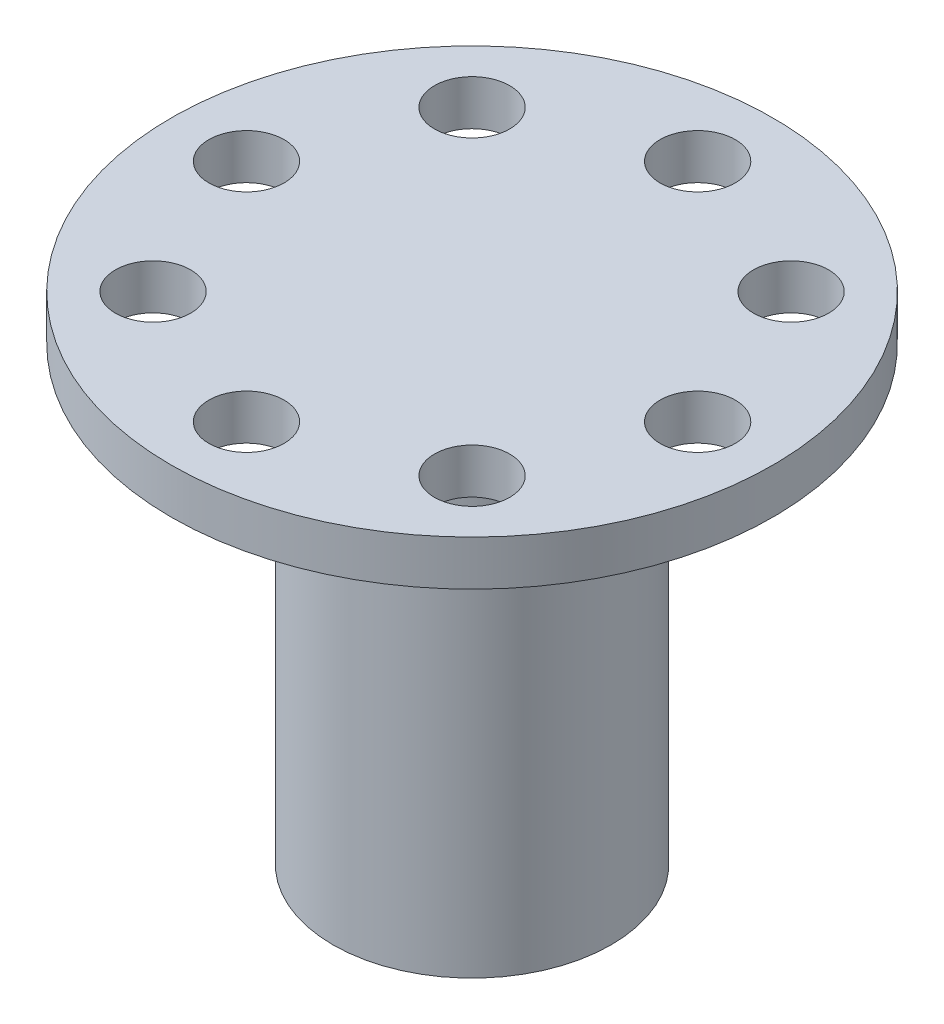
ISO-10303-21;
HEADER;
FILE_DESCRIPTION(('STEP AP214'),'2;1');
FILE_NAME('part.step','',(''),(''),'','','');
FILE_SCHEMA(('AUTOMOTIVE_DESIGN { 1 0 10303 214 1 1 1 1 }'));
ENDSEC;
DATA;
#1=APPLICATION_CONTEXT('core data for automotive mechanical design processes');
#2=APPLICATION_PROTOCOL_DEFINITION('international standard','automotive_design',2000,#1);
#3=PRODUCT_CONTEXT('',#1,'mechanical');
#4=PRODUCT('Part','Part','',(#3));
#5=PRODUCT_RELATED_PRODUCT_CATEGORY('part','',(#4));
#6=PRODUCT_DEFINITION_FORMATION('','',#4);
#7=PRODUCT_DEFINITION_CONTEXT('part definition',#1,'design');
#8=PRODUCT_DEFINITION('design','',#6,#7);
#9=PRODUCT_DEFINITION_SHAPE('','',#8);
#10=(LENGTH_UNIT() NAMED_UNIT(*) SI_UNIT(.MILLI.,.METRE.));
#11=(NAMED_UNIT(*) PLANE_ANGLE_UNIT() SI_UNIT($,.RADIAN.));
#12=(NAMED_UNIT(*) SI_UNIT($,.STERADIAN.) SOLID_ANGLE_UNIT());
#13=UNCERTAINTY_MEASURE_WITH_UNIT(LENGTH_MEASURE(1.E-05),#10,'distance_accuracy_value','');
#14=(GEOMETRIC_REPRESENTATION_CONTEXT(3) GLOBAL_UNCERTAINTY_ASSIGNED_CONTEXT((#13)) GLOBAL_UNIT_ASSIGNED_CONTEXT((#10,
#11,#12)) REPRESENTATION_CONTEXT('',''));
#15=CARTESIAN_POINT('',(0.,0.,0.));
#16=DIRECTION('',(0.,0.,1.));
#17=DIRECTION('',(1.,0.,0.));
#18=AXIS2_PLACEMENT_3D('',#15,#16,#17);
#19=CARTESIAN_POINT('',(0.,0.,0.));
#20=DIRECTION('',(0.,1.,0.));
#21=DIRECTION('',(0.,0.,1.));
#22=AXIS2_PLACEMENT_3D('',#19,#20,#21);
#23=PLANE('',#22);
#24=CARTESIAN_POINT('',(0.,0.,0.));
#25=DIRECTION('',(0.,1.,0.));
#26=DIRECTION('',(0.,0.,1.));
#27=AXIS2_PLACEMENT_3D('',#24,#25,#26);
#28=CIRCLE('',#27,9.25);
#29=CARTESIAN_POINT('',(0.,0.,9.25));
#30=VERTEX_POINT('',#29);
#31=EDGE_CURVE('E11',#30,#30,#28,.F.);
#32=ORIENTED_EDGE('',*,*,#31,.F.);
#33=EDGE_LOOP('',(#32));
#34=FACE_BOUND('',#33,.T.);
#35=CARTESIAN_POINT('',(15.,0.,0.));
#36=DIRECTION('',(0.,1.,0.));
#37=DIRECTION('',(0.,0.,1.));
#38=AXIS2_PLACEMENT_3D('',#35,#36,#37);
#39=CIRCLE('',#38,2.5);
#40=CARTESIAN_POINT('',(15.,0.,2.5));
#41=VERTEX_POINT('',#40);
#42=EDGE_CURVE('E58',#41,#41,#39,.T.);
#43=ORIENTED_EDGE('',*,*,#42,.T.);
#44=EDGE_LOOP('',(#43));
#45=FACE_BOUND('',#44,.T.);
#46=CARTESIAN_POINT('',(10.6066017177982,0.,10.6066017177982));
#47=DIRECTION('',(0.,1.,0.));
#48=DIRECTION('',(0.,0.,1.));
#49=AXIS2_PLACEMENT_3D('',#46,#47,#48);
#50=CIRCLE('',#49,2.5);
#51=CARTESIAN_POINT('',(10.6066017177982,0.,13.1066017177982));
#52=VERTEX_POINT('',#51);
#53=EDGE_CURVE('E77',#52,#52,#50,.T.);
#54=ORIENTED_EDGE('',*,*,#53,.T.);
#55=EDGE_LOOP('',(#54));
#56=FACE_BOUND('',#55,.T.);
#57=CARTESIAN_POINT('',(0.,0.,15.));
#58=DIRECTION('',(0.,1.,0.));
#59=DIRECTION('',(0.,0.,1.));
#60=AXIS2_PLACEMENT_3D('',#57,#58,#59);
#61=CIRCLE('',#60,2.5);
#62=CARTESIAN_POINT('',(0.,0.,17.5));
#63=VERTEX_POINT('',#62);
#64=EDGE_CURVE('E71',#63,#63,#61,.T.);
#65=ORIENTED_EDGE('',*,*,#64,.T.);
#66=EDGE_LOOP('',(#65));
#67=FACE_BOUND('',#66,.T.);
#68=CARTESIAN_POINT('',(-10.6066017177982,0.,10.6066017177982));
#69=DIRECTION('',(0.,1.,0.));
#70=DIRECTION('',(0.,0.,1.));
#71=AXIS2_PLACEMENT_3D('',#68,#69,#70);
#72=CIRCLE('',#71,2.5);
#73=CARTESIAN_POINT('',(-10.6066017177982,0.,13.1066017177982));
#74=VERTEX_POINT('',#73);
#75=EDGE_CURVE('E64',#74,#74,#72,.T.);
#76=ORIENTED_EDGE('',*,*,#75,.T.);
#77=EDGE_LOOP('',(#76));
#78=FACE_BOUND('',#77,.T.);
#79=CARTESIAN_POINT('',(-15.,0.,0.));
#80=DIRECTION('',(0.,1.,0.));
#81=DIRECTION('',(0.,0.,1.));
#82=AXIS2_PLACEMENT_3D('',#79,#80,#81);
#83=CIRCLE('',#82,2.5);
#84=CARTESIAN_POINT('',(-15.,0.,2.5));
#85=VERTEX_POINT('',#84);
#86=EDGE_CURVE('E65',#85,#85,#83,.T.);
#87=ORIENTED_EDGE('',*,*,#86,.T.);
#88=EDGE_LOOP('',(#87));
#89=FACE_BOUND('',#88,.T.);
#90=CARTESIAN_POINT('',(-10.6066017177982,0.,-10.6066017177982));
#91=DIRECTION('',(0.,1.,0.));
#92=DIRECTION('',(0.,0.,1.));
#93=AXIS2_PLACEMENT_3D('',#90,#91,#92);
#94=CIRCLE('',#93,2.5);
#95=CARTESIAN_POINT('',(-10.6066017177982,0.,-8.10660171779822));
#96=VERTEX_POINT('',#95);
#97=EDGE_CURVE('E95',#96,#96,#94,.T.);
#98=ORIENTED_EDGE('',*,*,#97,.T.);
#99=EDGE_LOOP('',(#98));
#100=FACE_BOUND('',#99,.T.);
#101=CARTESIAN_POINT('',(0.,0.,-15.));
#102=DIRECTION('',(0.,1.,0.));
#103=DIRECTION('',(0.,0.,1.));
#104=AXIS2_PLACEMENT_3D('',#101,#102,#103);
#105=CIRCLE('',#104,2.5);
#106=CARTESIAN_POINT('',(0.,0.,-12.5));
#107=VERTEX_POINT('',#106);
#108=EDGE_CURVE('E88',#107,#107,#105,.T.);
#109=ORIENTED_EDGE('',*,*,#108,.T.);
#110=EDGE_LOOP('',(#109));
#111=FACE_BOUND('',#110,.T.);
#112=CARTESIAN_POINT('',(10.6066017177982,0.,-10.6066017177982));
#113=DIRECTION('',(0.,1.,0.));
#114=DIRECTION('',(0.,0.,1.));
#115=AXIS2_PLACEMENT_3D('',#112,#113,#114);
#116=CIRCLE('',#115,2.5);
#117=CARTESIAN_POINT('',(10.6066017177982,0.,-8.10660171779822));
#118=VERTEX_POINT('',#117);
#119=EDGE_CURVE('E53',#118,#118,#116,.T.);
#120=ORIENTED_EDGE('',*,*,#119,.T.);
#121=EDGE_LOOP('',(#120));
#122=FACE_BOUND('',#121,.T.);
#123=CARTESIAN_POINT('',(0.,0.,0.));
#124=DIRECTION('',(0.,1.,0.));
#125=DIRECTION('',(0.,0.,1.));
#126=AXIS2_PLACEMENT_3D('',#123,#124,#125);
#127=CIRCLE('',#126,20.);
#128=CARTESIAN_POINT('',(0.,0.,20.));
#129=VERTEX_POINT('',#128);
#130=EDGE_CURVE('E48',#129,#129,#127,.T.);
#131=ORIENTED_EDGE('',*,*,#130,.F.);
#132=EDGE_LOOP('',(#131));
#133=FACE_BOUND('',#132,.T.);
#134=ADVANCED_FACE('F37',(#34,#45,#56,#67,#78,#89,#100,#111,#122,#133),#23,.F.);
#135=CARTESIAN_POINT('',(0.,3.,0.));
#136=DIRECTION('',(0.,-1.,0.));
#137=DIRECTION('',(0.,0.,-1.));
#138=AXIS2_PLACEMENT_3D('',#135,#136,#137);
#139=CYLINDRICAL_SURFACE('',#138,20.);
#140=CARTESIAN_POINT('',(0.,3.,0.));
#141=DIRECTION('',(0.,1.,0.));
#142=DIRECTION('',(0.,0.,1.));
#143=AXIS2_PLACEMENT_3D('',#140,#141,#142);
#144=CIRCLE('',#143,20.);
#145=CARTESIAN_POINT('',(0.,3.,20.));
#146=VERTEX_POINT('',#145);
#147=EDGE_CURVE('E44',#146,#146,#144,.T.);
#148=ORIENTED_EDGE('',*,*,#147,.F.);
#149=EDGE_LOOP('',(#148));
#150=FACE_BOUND('',#149,.T.);
#151=ORIENTED_EDGE('',*,*,#130,.T.);
#152=EDGE_LOOP('',(#151));
#153=FACE_BOUND('',#152,.T.);
#154=ADVANCED_FACE('F39',(#150,#153),#139,.T.);
#155=CARTESIAN_POINT('',(0.,3.,0.));
#156=DIRECTION('',(0.,1.,0.));
#157=DIRECTION('',(0.,0.,1.));
#158=AXIS2_PLACEMENT_3D('',#155,#156,#157);
#159=PLANE('',#158);
#160=CARTESIAN_POINT('',(15.,3.,0.));
#161=DIRECTION('',(0.,1.,0.));
#162=DIRECTION('',(0.,0.,1.));
#163=AXIS2_PLACEMENT_3D('',#160,#161,#162);
#164=CIRCLE('',#163,2.5);
#165=CARTESIAN_POINT('',(15.,3.,2.5));
#166=VERTEX_POINT('',#165);
#167=EDGE_CURVE('E80',#166,#166,#164,.T.);
#168=ORIENTED_EDGE('',*,*,#167,.F.);
#169=EDGE_LOOP('',(#168));
#170=FACE_BOUND('',#169,.T.);
#171=CARTESIAN_POINT('',(10.6066017177982,3.,10.6066017177982));
#172=DIRECTION('',(0.,1.,0.));
#173=DIRECTION('',(0.,0.,1.));
#174=AXIS2_PLACEMENT_3D('',#171,#172,#173);
#175=CIRCLE('',#174,2.5);
#176=CARTESIAN_POINT('',(10.6066017177982,3.,13.1066017177982));
#177=VERTEX_POINT('',#176);
#178=EDGE_CURVE('E74',#177,#177,#175,.T.);
#179=ORIENTED_EDGE('',*,*,#178,.F.);
#180=EDGE_LOOP('',(#179));
#181=FACE_BOUND('',#180,.T.);
#182=CARTESIAN_POINT('',(0.,3.,15.));
#183=DIRECTION('',(0.,1.,0.));
#184=DIRECTION('',(0.,0.,1.));
#185=AXIS2_PLACEMENT_3D('',#182,#183,#184);
#186=CIRCLE('',#185,2.5);
#187=CARTESIAN_POINT('',(0.,3.,17.5));
#188=VERTEX_POINT('',#187);
#189=EDGE_CURVE('E68',#188,#188,#186,.T.);
#190=ORIENTED_EDGE('',*,*,#189,.F.);
#191=EDGE_LOOP('',(#190));
#192=FACE_BOUND('',#191,.T.);
#193=CARTESIAN_POINT('',(-10.6066017177982,3.,10.6066017177982));
#194=DIRECTION('',(0.,1.,0.));
#195=DIRECTION('',(0.,0.,1.));
#196=AXIS2_PLACEMENT_3D('',#193,#194,#195);
#197=CIRCLE('',#196,2.5);
#198=CARTESIAN_POINT('',(-10.6066017177982,3.,13.1066017177982));
#199=VERTEX_POINT('',#198);
#200=EDGE_CURVE('E61',#199,#199,#197,.T.);
#201=ORIENTED_EDGE('',*,*,#200,.F.);
#202=EDGE_LOOP('',(#201));
#203=FACE_BOUND('',#202,.T.);
#204=CARTESIAN_POINT('',(-15.,3.,0.));
#205=DIRECTION('',(0.,1.,0.));
#206=DIRECTION('',(0.,0.,1.));
#207=AXIS2_PLACEMENT_3D('',#204,#205,#206);
#208=CIRCLE('',#207,2.5);
#209=CARTESIAN_POINT('',(-15.,3.,2.5));
#210=VERTEX_POINT('',#209);
#211=EDGE_CURVE('E98',#210,#210,#208,.T.);
#212=ORIENTED_EDGE('',*,*,#211,.F.);
#213=EDGE_LOOP('',(#212));
#214=FACE_BOUND('',#213,.T.);
#215=CARTESIAN_POINT('',(-10.6066017177982,3.,-10.6066017177982));
#216=DIRECTION('',(0.,1.,0.));
#217=DIRECTION('',(0.,0.,1.));
#218=AXIS2_PLACEMENT_3D('',#215,#216,#217);
#219=CIRCLE('',#218,2.5);
#220=CARTESIAN_POINT('',(-10.6066017177982,3.,-8.10660171779822));
#221=VERTEX_POINT('',#220);
#222=EDGE_CURVE('E92',#221,#221,#219,.T.);
#223=ORIENTED_EDGE('',*,*,#222,.F.);
#224=EDGE_LOOP('',(#223));
#225=FACE_BOUND('',#224,.T.);
#226=CARTESIAN_POINT('',(0.,3.,-15.));
#227=DIRECTION('',(0.,1.,0.));
#228=DIRECTION('',(0.,0.,1.));
#229=AXIS2_PLACEMENT_3D('',#226,#227,#228);
#230=CIRCLE('',#229,2.5);
#231=CARTESIAN_POINT('',(0.,3.,-12.5));
#232=VERTEX_POINT('',#231);
#233=EDGE_CURVE('E85',#232,#232,#230,.T.);
#234=ORIENTED_EDGE('',*,*,#233,.F.);
#235=EDGE_LOOP('',(#234));
#236=FACE_BOUND('',#235,.T.);
#237=CARTESIAN_POINT('',(10.6066017177982,3.,-10.6066017177982));
#238=DIRECTION('',(0.,1.,0.));
#239=DIRECTION('',(0.,0.,1.));
#240=AXIS2_PLACEMENT_3D('',#237,#238,#239);
#241=CIRCLE('',#240,2.5);
#242=CARTESIAN_POINT('',(10.6066017177982,3.,-8.10660171779822));
#243=VERTEX_POINT('',#242);
#244=EDGE_CURVE('E55',#243,#243,#241,.T.);
#245=ORIENTED_EDGE('',*,*,#244,.F.);
#246=EDGE_LOOP('',(#245));
#247=FACE_BOUND('',#246,.T.);
#248=ORIENTED_EDGE('',*,*,#147,.T.);
#249=EDGE_LOOP('',(#248));
#250=FACE_BOUND('',#249,.T.);
#251=ADVANCED_FACE('F132',(#170,#181,#192,#203,#214,#225,#236,#247,#250),#159,.T.);
#252=CARTESIAN_POINT('',(10.6066017177982,0.,-10.6066017177982));
#253=DIRECTION('',(0.,1.,0.));
#254=DIRECTION('',(0.,0.,1.));
#255=AXIS2_PLACEMENT_3D('',#252,#253,#254);
#256=CYLINDRICAL_SURFACE('',#255,2.5);
#257=ORIENTED_EDGE('',*,*,#119,.F.);
#258=EDGE_LOOP('',(#257));
#259=FACE_BOUND('',#258,.T.);
#260=ORIENTED_EDGE('',*,*,#244,.T.);
#261=EDGE_LOOP('',(#260));
#262=FACE_BOUND('',#261,.T.);
#263=ADVANCED_FACE('F138',(#259,#262),#256,.F.);
#264=CARTESIAN_POINT('',(0.,0.,-15.));
#265=DIRECTION('',(0.,1.,0.));
#266=DIRECTION('',(0.,0.,1.));
#267=AXIS2_PLACEMENT_3D('',#264,#265,#266);
#268=CYLINDRICAL_SURFACE('',#267,2.5);
#269=ORIENTED_EDGE('',*,*,#108,.F.);
#270=EDGE_LOOP('',(#269));
#271=FACE_BOUND('',#270,.T.);
#272=ORIENTED_EDGE('',*,*,#233,.T.);
#273=EDGE_LOOP('',(#272));
#274=FACE_BOUND('',#273,.T.);
#275=ADVANCED_FACE('F226',(#271,#274),#268,.F.);
#276=CARTESIAN_POINT('',(-10.6066017177982,0.,-10.6066017177982));
#277=DIRECTION('',(0.,1.,0.));
#278=DIRECTION('',(0.,0.,1.));
#279=AXIS2_PLACEMENT_3D('',#276,#277,#278);
#280=CYLINDRICAL_SURFACE('',#279,2.5);
#281=ORIENTED_EDGE('',*,*,#97,.F.);
#282=EDGE_LOOP('',(#281));
#283=FACE_BOUND('',#282,.T.);
#284=ORIENTED_EDGE('',*,*,#222,.T.);
#285=EDGE_LOOP('',(#284));
#286=FACE_BOUND('',#285,.T.);
#287=ADVANCED_FACE('F216',(#283,#286),#280,.F.);
#288=CARTESIAN_POINT('',(-15.,0.,0.));
#289=DIRECTION('',(0.,1.,0.));
#290=DIRECTION('',(0.,0.,1.));
#291=AXIS2_PLACEMENT_3D('',#288,#289,#290);
#292=CYLINDRICAL_SURFACE('',#291,2.5);
#293=ORIENTED_EDGE('',*,*,#86,.F.);
#294=EDGE_LOOP('',(#293));
#295=FACE_BOUND('',#294,.T.);
#296=ORIENTED_EDGE('',*,*,#211,.T.);
#297=EDGE_LOOP('',(#296));
#298=FACE_BOUND('',#297,.T.);
#299=ADVANCED_FACE('F206',(#295,#298),#292,.F.);
#300=CARTESIAN_POINT('',(-10.6066017177982,0.,10.6066017177982));
#301=DIRECTION('',(0.,1.,0.));
#302=DIRECTION('',(0.,0.,1.));
#303=AXIS2_PLACEMENT_3D('',#300,#301,#302);
#304=CYLINDRICAL_SURFACE('',#303,2.5);
#305=ORIENTED_EDGE('',*,*,#75,.F.);
#306=EDGE_LOOP('',(#305));
#307=FACE_BOUND('',#306,.T.);
#308=ORIENTED_EDGE('',*,*,#200,.T.);
#309=EDGE_LOOP('',(#308));
#310=FACE_BOUND('',#309,.T.);
#311=ADVANCED_FACE('F196',(#307,#310),#304,.F.);
#312=CARTESIAN_POINT('',(0.,0.,15.));
#313=DIRECTION('',(0.,1.,0.));
#314=DIRECTION('',(0.,0.,1.));
#315=AXIS2_PLACEMENT_3D('',#312,#313,#314);
#316=CYLINDRICAL_SURFACE('',#315,2.5);
#317=ORIENTED_EDGE('',*,*,#64,.F.);
#318=EDGE_LOOP('',(#317));
#319=FACE_BOUND('',#318,.T.);
#320=ORIENTED_EDGE('',*,*,#189,.T.);
#321=EDGE_LOOP('',(#320));
#322=FACE_BOUND('',#321,.T.);
#323=ADVANCED_FACE('F186',(#319,#322),#316,.F.);
#324=CARTESIAN_POINT('',(10.6066017177982,0.,10.6066017177982));
#325=DIRECTION('',(0.,1.,0.));
#326=DIRECTION('',(0.,0.,1.));
#327=AXIS2_PLACEMENT_3D('',#324,#325,#326);
#328=CYLINDRICAL_SURFACE('',#327,2.5);
#329=ORIENTED_EDGE('',*,*,#53,.F.);
#330=EDGE_LOOP('',(#329));
#331=FACE_BOUND('',#330,.T.);
#332=ORIENTED_EDGE('',*,*,#178,.T.);
#333=EDGE_LOOP('',(#332));
#334=FACE_BOUND('',#333,.T.);
#335=ADVANCED_FACE('F127',(#331,#334),#328,.F.);
#336=CARTESIAN_POINT('',(15.,0.,0.));
#337=DIRECTION('',(0.,1.,0.));
#338=DIRECTION('',(0.,0.,1.));
#339=AXIS2_PLACEMENT_3D('',#336,#337,#338);
#340=CYLINDRICAL_SURFACE('',#339,2.5);
#341=ORIENTED_EDGE('',*,*,#42,.F.);
#342=EDGE_LOOP('',(#341));
#343=FACE_BOUND('',#342,.T.);
#344=ORIENTED_EDGE('',*,*,#167,.T.);
#345=EDGE_LOOP('',(#344));
#346=FACE_BOUND('',#345,.T.);
#347=ADVANCED_FACE('F118',(#343,#346),#340,.F.);
#348=CARTESIAN_POINT('',(0.,-30.,0.));
#349=DIRECTION('',(0.,-1.,0.));
#350=DIRECTION('',(0.,0.,-1.));
#351=AXIS2_PLACEMENT_3D('',#348,#349,#350);
#352=PLANE('',#351);
#353=CARTESIAN_POINT('',(0.,-30.,0.));
#354=DIRECTION('',(0.,-1.,0.));
#355=DIRECTION('',(0.,0.,-1.));
#356=AXIS2_PLACEMENT_3D('',#353,#354,#355);
#357=CIRCLE('',#356,9.25);
#358=CARTESIAN_POINT('',(0.,-30.,-9.25));
#359=VERTEX_POINT('',#358);
#360=EDGE_CURVE('E89',#359,#359,#357,.T.);
#361=ORIENTED_EDGE('',*,*,#360,.T.);
#362=EDGE_LOOP('',(#361));
#363=FACE_BOUND('',#362,.T.);
#364=CARTESIAN_POINT('',(0.,-30.,0.));
#365=DIRECTION('',(0.,-1.,0.));
#366=DIRECTION('',(0.,0.,-1.));
#367=AXIS2_PLACEMENT_3D('',#364,#365,#366);
#368=CIRCLE('',#367,7.25);
#369=CARTESIAN_POINT('',(0.,-30.,-7.25));
#370=VERTEX_POINT('',#369);
#371=EDGE_CURVE('E105',#370,#370,#368,.T.);
#372=ORIENTED_EDGE('',*,*,#371,.F.);
#373=EDGE_LOOP('',(#372));
#374=FACE_BOUND('',#373,.T.);
#375=ADVANCED_FACE('F115',(#363,#374),#352,.T.);
#376=CARTESIAN_POINT('',(0.,-30.,0.));
#377=DIRECTION('',(0.,1.,0.));
#378=DIRECTION('',(0.,0.,1.));
#379=AXIS2_PLACEMENT_3D('',#376,#377,#378);
#380=CYLINDRICAL_SURFACE('',#379,9.25);
#381=ORIENTED_EDGE('',*,*,#360,.F.);
#382=EDGE_LOOP('',(#381));
#383=FACE_BOUND('',#382,.T.);
#384=ORIENTED_EDGE('',*,*,#31,.T.);
#385=EDGE_LOOP('',(#384));
#386=FACE_BOUND('',#385,.T.);
#387=ADVANCED_FACE('F117',(#383,#386),#380,.T.);
#388=CARTESIAN_POINT('',(0.,-30.,0.));
#389=DIRECTION('',(0.,1.,0.));
#390=DIRECTION('',(0.,0.,1.));
#391=AXIS2_PLACEMENT_3D('',#388,#389,#390);
#392=CYLINDRICAL_SURFACE('',#391,7.25);
#393=ORIENTED_EDGE('',*,*,#371,.T.);
#394=EDGE_LOOP('',(#393));
#395=FACE_BOUND('',#394,.T.);
#396=CARTESIAN_POINT('',(0.,0.,0.));
#397=DIRECTION('',(0.,-1.,0.));
#398=DIRECTION('',(0.,0.,-1.));
#399=AXIS2_PLACEMENT_3D('',#396,#397,#398);
#400=CIRCLE('',#399,7.25);
#401=CARTESIAN_POINT('',(0.,0.,-7.25));
#402=VERTEX_POINT('',#401);
#403=EDGE_CURVE('E106',#402,#402,#400,.T.);
#404=ORIENTED_EDGE('',*,*,#403,.F.);
#405=EDGE_LOOP('',(#404));
#406=FACE_BOUND('',#405,.T.);
#407=ADVANCED_FACE('F112',(#395,#406),#392,.F.);
#408=ORIENTED_EDGE('',*,*,#403,.T.);
#409=EDGE_LOOP('',(#408));
#410=FACE_BOUND('',#409,.T.);
#411=ADVANCED_FACE('F142',(#410),#23,.F.);
#412=CLOSED_SHELL('',(#134,#154,#251,#263,#275,#287,#299,#311,#323,#335,#347,#375,#387,#407,#411));
#413=MANIFOLD_SOLID_BREP('B2',#412);
#414=ADVANCED_BREP_SHAPE_REPRESENTATION('',(#18,#413),#14);
#415=SHAPE_DEFINITION_REPRESENTATION(#9,#414);
ENDSEC;
END-ISO-10303-21;
